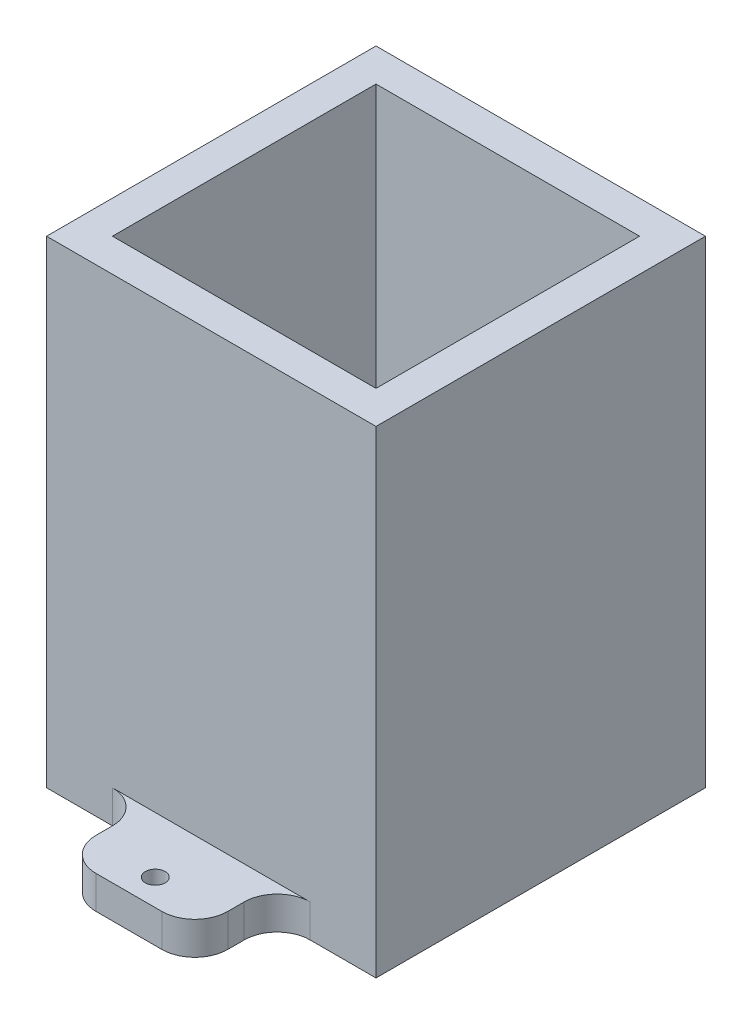
ISO-10303-21;
HEADER;
FILE_DESCRIPTION(('STEP AP214'),'2;1');
FILE_NAME('part.step','',(''),(''),'','','');
FILE_SCHEMA(('AUTOMOTIVE_DESIGN { 1 0 10303 214 1 1 1 1 }'));
ENDSEC;
DATA;
#1=APPLICATION_CONTEXT('core data for automotive mechanical design processes');
#2=APPLICATION_PROTOCOL_DEFINITION('international standard','automotive_design',2000,#1);
#3=PRODUCT_CONTEXT('',#1,'mechanical');
#4=PRODUCT('Part','Part','',(#3));
#5=PRODUCT_RELATED_PRODUCT_CATEGORY('part','',(#4));
#6=PRODUCT_DEFINITION_FORMATION('','',#4);
#7=PRODUCT_DEFINITION_CONTEXT('part definition',#1,'design');
#8=PRODUCT_DEFINITION('design','',#6,#7);
#9=PRODUCT_DEFINITION_SHAPE('','',#8);
#10=(LENGTH_UNIT() NAMED_UNIT(*) SI_UNIT(.MILLI.,.METRE.));
#11=(NAMED_UNIT(*) PLANE_ANGLE_UNIT() SI_UNIT($,.RADIAN.));
#12=(NAMED_UNIT(*) SI_UNIT($,.STERADIAN.) SOLID_ANGLE_UNIT());
#13=UNCERTAINTY_MEASURE_WITH_UNIT(LENGTH_MEASURE(1.E-05),#10,'distance_accuracy_value','');
#14=(GEOMETRIC_REPRESENTATION_CONTEXT(3) GLOBAL_UNCERTAINTY_ASSIGNED_CONTEXT((#13)) GLOBAL_UNIT_ASSIGNED_CONTEXT((#10,
#11,#12)) REPRESENTATION_CONTEXT('',''));
#15=CARTESIAN_POINT('',(0.,0.,0.));
#16=DIRECTION('',(0.,0.,1.));
#17=DIRECTION('',(1.,0.,0.));
#18=AXIS2_PLACEMENT_3D('',#15,#16,#17);
#19=CARTESIAN_POINT('',(-50.,140.,-50.));
#20=DIRECTION('',(0.,0.,1.));
#21=DIRECTION('',(1.,0.,0.));
#22=AXIS2_PLACEMENT_3D('',#19,#20,#21);
#23=PLANE('',#22);
#24=DIRECTION('',(-1.,0.,0.));
#25=VECTOR('',#24,1.);
#26=CARTESIAN_POINT('',(-20.,5.,-50.));
#27=LINE('',#26,#25);
#28=CARTESIAN_POINT('',(30.,5.,-50.));
#29=VERTEX_POINT('',#28);
#30=CARTESIAN_POINT('',(-30.,5.,-50.));
#31=VERTEX_POINT('',#30);
#32=EDGE_CURVE('E636',#29,#31,#27,.T.);
#33=ORIENTED_EDGE('',*,*,#32,.T.);
#34=DIRECTION('',(0.,-1.,0.));
#35=VECTOR('',#34,1.);
#36=CARTESIAN_POINT('',(-30.,140.,-50.));
#37=LINE('',#36,#35);
#38=CARTESIAN_POINT('',(-30.,-5.,-50.));
#39=VERTEX_POINT('',#38);
#40=EDGE_CURVE('E220',#31,#39,#37,.T.);
#41=ORIENTED_EDGE('',*,*,#40,.T.);
#42=DIRECTION('',(1.,0.,0.));
#43=VECTOR('',#42,1.);
#44=CARTESIAN_POINT('',(-50.,-5.,-50.));
#45=LINE('',#44,#43);
#46=CARTESIAN_POINT('',(-50.,-5.,-50.));
#47=VERTEX_POINT('',#46);
#48=EDGE_CURVE('E214',#47,#39,#45,.T.);
#49=ORIENTED_EDGE('',*,*,#48,.F.);
#50=DIRECTION('',(0.,-1.,0.));
#51=VECTOR('',#50,1.);
#52=CARTESIAN_POINT('',(-50.,140.,-50.));
#53=LINE('',#52,#51);
#54=CARTESIAN_POINT('',(-50.,140.,-50.));
#55=VERTEX_POINT('',#54);
#56=EDGE_CURVE('E205',#55,#47,#53,.T.);
#57=ORIENTED_EDGE('',*,*,#56,.F.);
#58=DIRECTION('',(-1.,0.,0.));
#59=VECTOR('',#58,1.);
#60=CARTESIAN_POINT('',(-50.,140.,-50.));
#61=LINE('',#60,#59);
#62=CARTESIAN_POINT('',(50.,140.,-50.));
#63=VERTEX_POINT('',#62);
#64=EDGE_CURVE('E274',#63,#55,#61,.T.);
#65=ORIENTED_EDGE('',*,*,#64,.F.);
#66=DIRECTION('',(0.,-1.,0.));
#67=VECTOR('',#66,1.);
#68=CARTESIAN_POINT('',(50.,140.,-50.));
#69=LINE('',#68,#67);
#70=CARTESIAN_POINT('',(50.,-5.,-50.));
#71=VERTEX_POINT('',#70);
#72=EDGE_CURVE('E209',#63,#71,#69,.T.);
#73=ORIENTED_EDGE('',*,*,#72,.T.);
#74=CARTESIAN_POINT('',(30.,-5.,-50.));
#75=VERTEX_POINT('',#74);
#76=EDGE_CURVE('E219',#75,#71,#45,.T.);
#77=ORIENTED_EDGE('',*,*,#76,.F.);
#78=DIRECTION('',(0.,-1.,0.));
#79=VECTOR('',#78,1.);
#80=CARTESIAN_POINT('',(30.,140.,-50.));
#81=LINE('',#80,#79);
#82=EDGE_CURVE('E281',#75,#29,#81,.F.);
#83=ORIENTED_EDGE('',*,*,#82,.T.);
#84=EDGE_LOOP('',(#33,#41,#49,#57,#65,#73,#77,#83));
#85=FACE_BOUND('',#84,.T.);
#86=ADVANCED_FACE('F39',(#85),#23,.F.);
#87=CARTESIAN_POINT('',(-50.,140.,50.));
#88=DIRECTION('',(0.,0.,-1.));
#89=DIRECTION('',(-1.,0.,0.));
#90=AXIS2_PLACEMENT_3D('',#87,#88,#89);
#91=PLANE('',#90);
#92=DIRECTION('',(1.,0.,0.));
#93=VECTOR('',#92,1.);
#94=CARTESIAN_POINT('',(-20.,5.,50.));
#95=LINE('',#94,#93);
#96=CARTESIAN_POINT('',(-30.,5.,50.));
#97=VERTEX_POINT('',#96);
#98=CARTESIAN_POINT('',(30.,5.,50.));
#99=VERTEX_POINT('',#98);
#100=EDGE_CURVE('E368',#97,#99,#95,.T.);
#101=ORIENTED_EDGE('',*,*,#100,.T.);
#102=DIRECTION('',(0.,-1.,0.));
#103=VECTOR('',#102,1.);
#104=CARTESIAN_POINT('',(30.,140.,50.));
#105=LINE('',#104,#103);
#106=CARTESIAN_POINT('',(30.,-5.,50.));
#107=VERTEX_POINT('',#106);
#108=EDGE_CURVE('E317',#99,#107,#105,.T.);
#109=ORIENTED_EDGE('',*,*,#108,.T.);
#110=DIRECTION('',(-1.,0.,0.));
#111=VECTOR('',#110,1.);
#112=CARTESIAN_POINT('',(-50.,-5.,50.));
#113=LINE('',#112,#111);
#114=CARTESIAN_POINT('',(50.,-5.,50.));
#115=VERTEX_POINT('',#114);
#116=EDGE_CURVE('E240',#115,#107,#113,.T.);
#117=ORIENTED_EDGE('',*,*,#116,.F.);
#118=DIRECTION('',(0.,-1.,0.));
#119=VECTOR('',#118,1.);
#120=CARTESIAN_POINT('',(50.,140.,50.));
#121=LINE('',#120,#119);
#122=CARTESIAN_POINT('',(50.,140.,50.));
#123=VERTEX_POINT('',#122);
#124=EDGE_CURVE('E278',#123,#115,#121,.T.);
#125=ORIENTED_EDGE('',*,*,#124,.F.);
#126=DIRECTION('',(1.,0.,0.));
#127=VECTOR('',#126,1.);
#128=CARTESIAN_POINT('',(-50.,140.,50.));
#129=LINE('',#128,#127);
#130=CARTESIAN_POINT('',(-50.,140.,50.));
#131=VERTEX_POINT('',#130);
#132=EDGE_CURVE('E279',#131,#123,#129,.T.);
#133=ORIENTED_EDGE('',*,*,#132,.F.);
#134=DIRECTION('',(0.,-1.,0.));
#135=VECTOR('',#134,1.);
#136=CARTESIAN_POINT('',(-50.,140.,50.));
#137=LINE('',#136,#135);
#138=CARTESIAN_POINT('',(-50.,-5.,50.));
#139=VERTEX_POINT('',#138);
#140=EDGE_CURVE('E211',#131,#139,#137,.T.);
#141=ORIENTED_EDGE('',*,*,#140,.T.);
#142=CARTESIAN_POINT('',(-30.,-5.,50.));
#143=VERTEX_POINT('',#142);
#144=EDGE_CURVE('E228',#143,#139,#113,.T.);
#145=ORIENTED_EDGE('',*,*,#144,.F.);
#146=DIRECTION('',(0.,-1.,0.));
#147=VECTOR('',#146,1.);
#148=CARTESIAN_POINT('',(-30.,140.,50.));
#149=LINE('',#148,#147);
#150=EDGE_CURVE('E316',#143,#97,#149,.F.);
#151=ORIENTED_EDGE('',*,*,#150,.T.);
#152=EDGE_LOOP('',(#101,#109,#117,#125,#133,#141,#145,#151));
#153=FACE_BOUND('',#152,.T.);
#154=ADVANCED_FACE('F357',(#153),#91,.F.);
#155=CARTESIAN_POINT('',(0.,140.,0.));
#156=DIRECTION('',(0.,-1.,0.));
#157=DIRECTION('',(0.,0.,-1.));
#158=AXIS2_PLACEMENT_3D('',#155,#156,#157);
#159=PLANE('',#158);
#160=DIRECTION('',(0.,0.,-1.));
#161=VECTOR('',#160,1.);
#162=CARTESIAN_POINT('',(50.,140.,50.));
#163=LINE('',#162,#161);
#164=EDGE_CURVE('E275',#123,#63,#163,.T.);
#165=ORIENTED_EDGE('',*,*,#164,.T.);
#166=ORIENTED_EDGE('',*,*,#64,.T.);
#167=DIRECTION('',(0.,0.,1.));
#168=VECTOR('',#167,1.);
#169=CARTESIAN_POINT('',(-50.,140.,50.));
#170=LINE('',#169,#168);
#171=EDGE_CURVE('E208',#55,#131,#170,.T.);
#172=ORIENTED_EDGE('',*,*,#171,.T.);
#173=ORIENTED_EDGE('',*,*,#132,.T.);
#174=EDGE_LOOP('',(#165,#166,#172,#173));
#175=FACE_BOUND('',#174,.T.);
#176=DIRECTION('',(0.,0.,1.));
#177=VECTOR('',#176,1.);
#178=CARTESIAN_POINT('',(-40.,140.,40.));
#179=LINE('',#178,#177);
#180=CARTESIAN_POINT('',(-40.,140.,-40.));
#181=VERTEX_POINT('',#180);
#182=CARTESIAN_POINT('',(-40.,140.,40.));
#183=VERTEX_POINT('',#182);
#184=EDGE_CURVE('E243',#181,#183,#179,.T.);
#185=ORIENTED_EDGE('',*,*,#184,.F.);
#186=DIRECTION('',(-1.,0.,0.));
#187=VECTOR('',#186,1.);
#188=CARTESIAN_POINT('',(-40.,140.,-40.));
#189=LINE('',#188,#187);
#190=CARTESIAN_POINT('',(40.,140.,-40.));
#191=VERTEX_POINT('',#190);
#192=EDGE_CURVE('E247',#191,#181,#189,.T.);
#193=ORIENTED_EDGE('',*,*,#192,.F.);
#194=DIRECTION('',(0.,0.,-1.));
#195=VECTOR('',#194,1.);
#196=CARTESIAN_POINT('',(40.,140.,40.));
#197=LINE('',#196,#195);
#198=CARTESIAN_POINT('',(40.,140.,40.));
#199=VERTEX_POINT('',#198);
#200=EDGE_CURVE('E248',#199,#191,#197,.T.);
#201=ORIENTED_EDGE('',*,*,#200,.F.);
#202=DIRECTION('',(1.,0.,0.));
#203=VECTOR('',#202,1.);
#204=CARTESIAN_POINT('',(-40.,140.,40.));
#205=LINE('',#204,#203);
#206=EDGE_CURVE('E242',#183,#199,#205,.T.);
#207=ORIENTED_EDGE('',*,*,#206,.F.);
#208=EDGE_LOOP('',(#185,#193,#201,#207));
#209=FACE_BOUND('',#208,.T.);
#210=ADVANCED_FACE('F412',(#175,#209),#159,.F.);
#211=CARTESIAN_POINT('',(50.,140.,50.));
#212=DIRECTION('',(-1.,0.,0.));
#213=DIRECTION('',(0.,0.,1.));
#214=AXIS2_PLACEMENT_3D('',#211,#212,#213);
#215=PLANE('',#214);
#216=ORIENTED_EDGE('',*,*,#124,.T.);
#217=DIRECTION('',(0.,0.,1.));
#218=VECTOR('',#217,1.);
#219=CARTESIAN_POINT('',(50.,-5.,-50.));
#220=LINE('',#219,#218);
#221=EDGE_CURVE('E218',#71,#115,#220,.T.);
#222=ORIENTED_EDGE('',*,*,#221,.F.);
#223=ORIENTED_EDGE('',*,*,#72,.F.);
#224=ORIENTED_EDGE('',*,*,#164,.F.);
#225=EDGE_LOOP('',(#216,#222,#223,#224));
#226=FACE_BOUND('',#225,.T.);
#227=ADVANCED_FACE('F416',(#226),#215,.F.);
#228=CARTESIAN_POINT('',(-50.,140.,50.));
#229=DIRECTION('',(1.,0.,0.));
#230=DIRECTION('',(0.,0.,-1.));
#231=AXIS2_PLACEMENT_3D('',#228,#229,#230);
#232=PLANE('',#231);
#233=ORIENTED_EDGE('',*,*,#56,.T.);
#234=DIRECTION('',(0.,0.,-1.));
#235=VECTOR('',#234,1.);
#236=CARTESIAN_POINT('',(-50.,-5.,-50.));
#237=LINE('',#236,#235);
#238=EDGE_CURVE('E210',#139,#47,#237,.T.);
#239=ORIENTED_EDGE('',*,*,#238,.F.);
#240=ORIENTED_EDGE('',*,*,#140,.F.);
#241=ORIENTED_EDGE('',*,*,#171,.F.);
#242=EDGE_LOOP('',(#233,#239,#240,#241));
#243=FACE_BOUND('',#242,.T.);
#244=ADVANCED_FACE('F204',(#243),#232,.F.);
#245=CARTESIAN_POINT('',(-40.,140.,40.));
#246=DIRECTION('',(1.,0.,0.));
#247=DIRECTION('',(0.,0.,-1.));
#248=AXIS2_PLACEMENT_3D('',#245,#246,#247);
#249=PLANE('',#248);
#250=DIRECTION('',(0.,0.,1.));
#251=VECTOR('',#250,1.);
#252=CARTESIAN_POINT('',(-40.,0.,40.));
#253=LINE('',#252,#251);
#254=CARTESIAN_POINT('',(-40.,0.,-40.));
#255=VERTEX_POINT('',#254);
#256=CARTESIAN_POINT('',(-40.,0.,40.));
#257=VERTEX_POINT('',#256);
#258=EDGE_CURVE('E238',#255,#257,#253,.T.);
#259=ORIENTED_EDGE('',*,*,#258,.F.);
#260=DIRECTION('',(0.,-1.,0.));
#261=VECTOR('',#260,1.);
#262=CARTESIAN_POINT('',(-40.,140.,-40.));
#263=LINE('',#262,#261);
#264=EDGE_CURVE('E253',#181,#255,#263,.T.);
#265=ORIENTED_EDGE('',*,*,#264,.F.);
#266=ORIENTED_EDGE('',*,*,#184,.T.);
#267=DIRECTION('',(0.,-1.,0.));
#268=VECTOR('',#267,1.);
#269=CARTESIAN_POINT('',(-40.,140.,40.));
#270=LINE('',#269,#268);
#271=EDGE_CURVE('E267',#183,#257,#270,.T.);
#272=ORIENTED_EDGE('',*,*,#271,.T.);
#273=EDGE_LOOP('',(#259,#265,#266,#272));
#274=FACE_BOUND('',#273,.T.);
#275=ADVANCED_FACE('F602',(#274),#249,.T.);
#276=CARTESIAN_POINT('',(-40.,140.,40.));
#277=DIRECTION('',(0.,0.,-1.));
#278=DIRECTION('',(-1.,0.,0.));
#279=AXIS2_PLACEMENT_3D('',#276,#277,#278);
#280=PLANE('',#279);
#281=DIRECTION('',(1.,0.,0.));
#282=VECTOR('',#281,1.);
#283=CARTESIAN_POINT('',(-40.,0.,40.));
#284=LINE('',#283,#282);
#285=CARTESIAN_POINT('',(40.,0.,40.));
#286=VERTEX_POINT('',#285);
#287=EDGE_CURVE('E255',#257,#286,#284,.T.);
#288=ORIENTED_EDGE('',*,*,#287,.F.);
#289=ORIENTED_EDGE('',*,*,#271,.F.);
#290=ORIENTED_EDGE('',*,*,#206,.T.);
#291=DIRECTION('',(0.,-1.,0.));
#292=VECTOR('',#291,1.);
#293=CARTESIAN_POINT('',(40.,140.,40.));
#294=LINE('',#293,#292);
#295=EDGE_CURVE('E270',#199,#286,#294,.T.);
#296=ORIENTED_EDGE('',*,*,#295,.T.);
#297=EDGE_LOOP('',(#288,#289,#290,#296));
#298=FACE_BOUND('',#297,.T.);
#299=ADVANCED_FACE('F597',(#298),#280,.T.);
#300=CARTESIAN_POINT('',(40.,140.,40.));
#301=DIRECTION('',(-1.,0.,0.));
#302=DIRECTION('',(0.,0.,1.));
#303=AXIS2_PLACEMENT_3D('',#300,#301,#302);
#304=PLANE('',#303);
#305=DIRECTION('',(0.,0.,-1.));
#306=VECTOR('',#305,1.);
#307=CARTESIAN_POINT('',(40.,0.,40.));
#308=LINE('',#307,#306);
#309=CARTESIAN_POINT('',(40.,0.,-40.));
#310=VERTEX_POINT('',#309);
#311=EDGE_CURVE('E260',#286,#310,#308,.T.);
#312=ORIENTED_EDGE('',*,*,#311,.F.);
#313=ORIENTED_EDGE('',*,*,#295,.F.);
#314=ORIENTED_EDGE('',*,*,#200,.T.);
#315=DIRECTION('',(0.,-1.,0.));
#316=VECTOR('',#315,1.);
#317=CARTESIAN_POINT('',(40.,140.,-40.));
#318=LINE('',#317,#316);
#319=EDGE_CURVE('E262',#191,#310,#318,.T.);
#320=ORIENTED_EDGE('',*,*,#319,.T.);
#321=EDGE_LOOP('',(#312,#313,#314,#320));
#322=FACE_BOUND('',#321,.T.);
#323=ADVANCED_FACE('F594',(#322),#304,.T.);
#324=CARTESIAN_POINT('',(-40.,140.,-40.));
#325=DIRECTION('',(0.,0.,1.));
#326=DIRECTION('',(1.,0.,0.));
#327=AXIS2_PLACEMENT_3D('',#324,#325,#326);
#328=PLANE('',#327);
#329=DIRECTION('',(-1.,0.,0.));
#330=VECTOR('',#329,1.);
#331=CARTESIAN_POINT('',(-40.,0.,-40.));
#332=LINE('',#331,#330);
#333=EDGE_CURVE('E245',#310,#255,#332,.T.);
#334=ORIENTED_EDGE('',*,*,#333,.F.);
#335=ORIENTED_EDGE('',*,*,#319,.F.);
#336=ORIENTED_EDGE('',*,*,#192,.T.);
#337=ORIENTED_EDGE('',*,*,#264,.T.);
#338=EDGE_LOOP('',(#334,#335,#336,#337));
#339=FACE_BOUND('',#338,.T.);
#340=ADVANCED_FACE('F536',(#339),#328,.T.);
#341=CARTESIAN_POINT('',(0.,-5.,0.));
#342=DIRECTION('',(0.,1.,0.));
#343=DIRECTION('',(0.,0.,1.));
#344=AXIS2_PLACEMENT_3D('',#341,#342,#343);
#345=PLANE('',#344);
#346=CARTESIAN_POINT('',(0.,-5.,-67.));
#347=DIRECTION('',(0.,1.,0.));
#348=DIRECTION('',(0.,0.,1.));
#349=AXIS2_PLACEMENT_3D('',#346,#347,#348);
#350=CIRCLE('',#349,3.);
#351=CARTESIAN_POINT('',(0.,-5.,-64.));
#352=VERTEX_POINT('',#351);
#353=EDGE_CURVE('E651',#352,#352,#350,.T.);
#354=ORIENTED_EDGE('',*,*,#353,.T.);
#355=EDGE_LOOP('',(#354));
#356=FACE_BOUND('',#355,.T.);
#357=CARTESIAN_POINT('',(0.,-5.,67.));
#358=DIRECTION('',(0.,1.,0.));
#359=DIRECTION('',(0.,0.,-1.));
#360=AXIS2_PLACEMENT_3D('',#357,#358,#359);
#361=CIRCLE('',#360,3.);
#362=CARTESIAN_POINT('',(0.,-5.,64.));
#363=VERTEX_POINT('',#362);
#364=EDGE_CURVE('E659',#363,#363,#361,.T.);
#365=ORIENTED_EDGE('',*,*,#364,.T.);
#366=EDGE_LOOP('',(#365));
#367=FACE_BOUND('',#366,.T.);
#368=DIRECTION('',(0.,0.,-1.));
#369=VECTOR('',#368,1.);
#370=CARTESIAN_POINT('',(-20.,-5.,-50.));
#371=LINE('',#370,#369);
#372=CARTESIAN_POINT('',(-20.,-5.,-60.));
#373=VERTEX_POINT('',#372);
#374=CARTESIAN_POINT('',(-20.,-5.,-65.));
#375=VERTEX_POINT('',#374);
#376=EDGE_CURVE('E647',#373,#375,#371,.T.);
#377=ORIENTED_EDGE('',*,*,#376,.T.);
#378=CARTESIAN_POINT('',(-10.,-5.,-65.));
#379=DIRECTION('',(0.,1.,0.));
#380=DIRECTION('',(0.,0.,1.));
#381=AXIS2_PLACEMENT_3D('',#378,#379,#380);
#382=CIRCLE('',#381,10.);
#383=CARTESIAN_POINT('',(-10.,-5.,-75.));
#384=VERTEX_POINT('',#383);
#385=EDGE_CURVE('E304',#375,#384,#382,.F.);
#386=ORIENTED_EDGE('',*,*,#385,.T.);
#387=DIRECTION('',(1.,0.,0.));
#388=VECTOR('',#387,1.);
#389=CARTESIAN_POINT('',(-20.,-5.,-75.));
#390=LINE('',#389,#388);
#391=CARTESIAN_POINT('',(10.,-5.,-75.));
#392=VERTEX_POINT('',#391);
#393=EDGE_CURVE('E649',#384,#392,#390,.T.);
#394=ORIENTED_EDGE('',*,*,#393,.T.);
#395=CARTESIAN_POINT('',(10.,-5.,-65.));
#396=DIRECTION('',(0.,1.,0.));
#397=DIRECTION('',(0.,0.,1.));
#398=AXIS2_PLACEMENT_3D('',#395,#396,#397);
#399=CIRCLE('',#398,10.);
#400=CARTESIAN_POINT('',(20.,-5.,-65.));
#401=VERTEX_POINT('',#400);
#402=EDGE_CURVE('E301',#392,#401,#399,.F.);
#403=ORIENTED_EDGE('',*,*,#402,.T.);
#404=DIRECTION('',(0.,0.,1.));
#405=VECTOR('',#404,1.);
#406=CARTESIAN_POINT('',(20.,-5.,-50.));
#407=LINE('',#406,#405);
#408=CARTESIAN_POINT('',(20.,-5.,-60.));
#409=VERTEX_POINT('',#408);
#410=EDGE_CURVE('E378',#401,#409,#407,.T.);
#411=ORIENTED_EDGE('',*,*,#410,.T.);
#412=CARTESIAN_POINT('',(30.,-5.,-60.));
#413=DIRECTION('',(0.,1.,0.));
#414=DIRECTION('',(0.,0.,1.));
#415=AXIS2_PLACEMENT_3D('',#412,#413,#414);
#416=CIRCLE('',#415,10.);
#417=EDGE_CURVE('E342',#409,#75,#416,.T.);
#418=ORIENTED_EDGE('',*,*,#417,.T.);
#419=ORIENTED_EDGE('',*,*,#76,.T.);
#420=ORIENTED_EDGE('',*,*,#221,.T.);
#421=ORIENTED_EDGE('',*,*,#116,.T.);
#422=CARTESIAN_POINT('',(30.,-5.,60.));
#423=DIRECTION('',(0.,1.,0.));
#424=DIRECTION('',(0.,0.,1.));
#425=AXIS2_PLACEMENT_3D('',#422,#423,#424);
#426=CIRCLE('',#425,10.);
#427=CARTESIAN_POINT('',(20.,-5.,60.));
#428=VERTEX_POINT('',#427);
#429=EDGE_CURVE('E346',#107,#428,#426,.T.);
#430=ORIENTED_EDGE('',*,*,#429,.T.);
#431=DIRECTION('',(0.,0.,1.));
#432=VECTOR('',#431,1.);
#433=CARTESIAN_POINT('',(20.,-5.,50.));
#434=LINE('',#433,#432);
#435=CARTESIAN_POINT('',(20.,-5.,65.));
#436=VERTEX_POINT('',#435);
#437=EDGE_CURVE('E374',#428,#436,#434,.T.);
#438=ORIENTED_EDGE('',*,*,#437,.T.);
#439=CARTESIAN_POINT('',(10.,-5.,65.));
#440=DIRECTION('',(0.,1.,0.));
#441=DIRECTION('',(0.,0.,1.));
#442=AXIS2_PLACEMENT_3D('',#439,#440,#441);
#443=CIRCLE('',#442,10.);
#444=CARTESIAN_POINT('',(10.,-5.,75.));
#445=VERTEX_POINT('',#444);
#446=EDGE_CURVE('E303',#436,#445,#443,.F.);
#447=ORIENTED_EDGE('',*,*,#446,.T.);
#448=DIRECTION('',(-1.,0.,0.));
#449=VECTOR('',#448,1.);
#450=CARTESIAN_POINT('',(-20.,-5.,75.));
#451=LINE('',#450,#449);
#452=CARTESIAN_POINT('',(-10.,-5.,75.));
#453=VERTEX_POINT('',#452);
#454=EDGE_CURVE('E367',#445,#453,#451,.T.);
#455=ORIENTED_EDGE('',*,*,#454,.T.);
#456=CARTESIAN_POINT('',(-10.,-5.,65.));
#457=DIRECTION('',(0.,1.,0.));
#458=DIRECTION('',(0.,0.,1.));
#459=AXIS2_PLACEMENT_3D('',#456,#457,#458);
#460=CIRCLE('',#459,10.);
#461=CARTESIAN_POINT('',(-20.,-5.,65.));
#462=VERTEX_POINT('',#461);
#463=EDGE_CURVE('E300',#453,#462,#460,.F.);
#464=ORIENTED_EDGE('',*,*,#463,.T.);
#465=DIRECTION('',(0.,0.,-1.));
#466=VECTOR('',#465,1.);
#467=CARTESIAN_POINT('',(-20.,-5.,50.));
#468=LINE('',#467,#466);
#469=CARTESIAN_POINT('',(-20.,-5.,60.));
#470=VERTEX_POINT('',#469);
#471=EDGE_CURVE('E355',#462,#470,#468,.T.);
#472=ORIENTED_EDGE('',*,*,#471,.T.);
#473=CARTESIAN_POINT('',(-30.,-5.,60.));
#474=DIRECTION('',(0.,1.,0.));
#475=DIRECTION('',(0.,0.,1.));
#476=AXIS2_PLACEMENT_3D('',#473,#474,#475);
#477=CIRCLE('',#476,10.);
#478=EDGE_CURVE('E50',#470,#143,#477,.T.);
#479=ORIENTED_EDGE('',*,*,#478,.T.);
#480=ORIENTED_EDGE('',*,*,#144,.T.);
#481=ORIENTED_EDGE('',*,*,#238,.T.);
#482=ORIENTED_EDGE('',*,*,#48,.T.);
#483=CARTESIAN_POINT('',(-30.,-5.,-60.));
#484=DIRECTION('',(0.,1.,0.));
#485=DIRECTION('',(0.,0.,1.));
#486=AXIS2_PLACEMENT_3D('',#483,#484,#485);
#487=CIRCLE('',#486,10.);
#488=EDGE_CURVE('E340',#39,#373,#487,.T.);
#489=ORIENTED_EDGE('',*,*,#488,.T.);
#490=EDGE_LOOP('',(#377,#386,#394,#403,#411,#418,#419,#420,#421,#430,#438,#447,#455,#464,#472,
#479,#480,#481,#482,#489));
#491=FACE_BOUND('',#490,.T.);
#492=CARTESIAN_POINT('',(0.,-5.,0.));
#493=DIRECTION('',(0.,-1.,0.));
#494=DIRECTION('',(0.,0.,-1.));
#495=AXIS2_PLACEMENT_3D('',#492,#493,#494);
#496=CIRCLE('',#495,25.);
#497=CARTESIAN_POINT('',(0.,-5.,-25.));
#498=VERTEX_POINT('',#497);
#499=EDGE_CURVE('E227',#498,#498,#496,.T.);
#500=ORIENTED_EDGE('',*,*,#499,.F.);
#501=EDGE_LOOP('',(#500));
#502=FACE_BOUND('',#501,.T.);
#503=ADVANCED_FACE('F224',(#356,#367,#491,#502),#345,.F.);
#504=CARTESIAN_POINT('',(0.,0.,0.));
#505=DIRECTION('',(0.,1.,0.));
#506=DIRECTION('',(0.,0.,1.));
#507=AXIS2_PLACEMENT_3D('',#504,#505,#506);
#508=PLANE('',#507);
#509=ORIENTED_EDGE('',*,*,#311,.T.);
#510=ORIENTED_EDGE('',*,*,#333,.T.);
#511=ORIENTED_EDGE('',*,*,#258,.T.);
#512=ORIENTED_EDGE('',*,*,#287,.T.);
#513=EDGE_LOOP('',(#509,#510,#511,#512));
#514=FACE_BOUND('',#513,.T.);
#515=CARTESIAN_POINT('',(0.,0.,0.));
#516=DIRECTION('',(0.,-1.,0.));
#517=DIRECTION('',(0.,0.,-1.));
#518=AXIS2_PLACEMENT_3D('',#515,#516,#517);
#519=CIRCLE('',#518,25.);
#520=CARTESIAN_POINT('',(0.,0.,-25.));
#521=VERTEX_POINT('',#520);
#522=EDGE_CURVE('E233',#521,#521,#519,.T.);
#523=ORIENTED_EDGE('',*,*,#522,.T.);
#524=EDGE_LOOP('',(#523));
#525=FACE_BOUND('',#524,.T.);
#526=ADVANCED_FACE('F532',(#514,#525),#508,.T.);
#527=CARTESIAN_POINT('',(0.,-5.,0.));
#528=DIRECTION('',(0.,1.,0.));
#529=DIRECTION('',(0.,0.,1.));
#530=AXIS2_PLACEMENT_3D('',#527,#528,#529);
#531=CYLINDRICAL_SURFACE('',#530,25.);
#532=ORIENTED_EDGE('',*,*,#499,.T.);
#533=EDGE_LOOP('',(#532));
#534=FACE_BOUND('',#533,.T.);
#535=ORIENTED_EDGE('',*,*,#522,.F.);
#536=EDGE_LOOP('',(#535));
#537=FACE_BOUND('',#536,.T.);
#538=ADVANCED_FACE('F530',(#534,#537),#531,.F.);
#539=CARTESIAN_POINT('',(-20.,5.,50.));
#540=DIRECTION('',(-1.,0.,0.));
#541=DIRECTION('',(0.,0.,1.));
#542=AXIS2_PLACEMENT_3D('',#539,#540,#541);
#543=PLANE('',#542);
#544=DIRECTION('',(0.,0.,-1.));
#545=VECTOR('',#544,1.);
#546=CARTESIAN_POINT('',(-20.,5.,50.));
#547=LINE('',#546,#545);
#548=CARTESIAN_POINT('',(-20.,5.,65.));
#549=VERTEX_POINT('',#548);
#550=CARTESIAN_POINT('',(-20.,5.,60.));
#551=VERTEX_POINT('',#550);
#552=EDGE_CURVE('E364',#549,#551,#547,.T.);
#553=ORIENTED_EDGE('',*,*,#552,.T.);
#554=DIRECTION('',(0.,-1.,0.));
#555=VECTOR('',#554,1.);
#556=CARTESIAN_POINT('',(-20.,5.,60.));
#557=LINE('',#556,#555);
#558=EDGE_CURVE('E328',#551,#470,#557,.T.);
#559=ORIENTED_EDGE('',*,*,#558,.T.);
#560=ORIENTED_EDGE('',*,*,#471,.F.);
#561=DIRECTION('',(0.,-1.,0.));
#562=VECTOR('',#561,1.);
#563=CARTESIAN_POINT('',(-20.,5.,65.));
#564=LINE('',#563,#562);
#565=EDGE_CURVE('E330',#462,#549,#564,.F.);
#566=ORIENTED_EDGE('',*,*,#565,.T.);
#567=EDGE_LOOP('',(#553,#559,#560,#566));
#568=FACE_BOUND('',#567,.T.);
#569=ADVANCED_FACE('F366',(#568),#543,.T.);
#570=CARTESIAN_POINT('',(-20.,5.,75.));
#571=DIRECTION('',(0.,0.,1.));
#572=DIRECTION('',(1.,0.,0.));
#573=AXIS2_PLACEMENT_3D('',#570,#571,#572);
#574=PLANE('',#573);
#575=ORIENTED_EDGE('',*,*,#454,.F.);
#576=DIRECTION('',(0.,-1.,0.));
#577=VECTOR('',#576,1.);
#578=CARTESIAN_POINT('',(10.,5.,75.));
#579=LINE('',#578,#577);
#580=CARTESIAN_POINT('',(10.,5.,75.));
#581=VERTEX_POINT('',#580);
#582=EDGE_CURVE('E63',#445,#581,#579,.F.);
#583=ORIENTED_EDGE('',*,*,#582,.T.);
#584=DIRECTION('',(-1.,0.,0.));
#585=VECTOR('',#584,1.);
#586=CARTESIAN_POINT('',(-20.,5.,75.));
#587=LINE('',#586,#585);
#588=CARTESIAN_POINT('',(-10.,5.,75.));
#589=VERTEX_POINT('',#588);
#590=EDGE_CURVE('E382',#581,#589,#587,.T.);
#591=ORIENTED_EDGE('',*,*,#590,.T.);
#592=DIRECTION('',(0.,-1.,0.));
#593=VECTOR('',#592,1.);
#594=CARTESIAN_POINT('',(-10.,5.,75.));
#595=LINE('',#594,#593);
#596=EDGE_CURVE('E335',#589,#453,#595,.T.);
#597=ORIENTED_EDGE('',*,*,#596,.T.);
#598=EDGE_LOOP('',(#575,#583,#591,#597));
#599=FACE_BOUND('',#598,.T.);
#600=ADVANCED_FACE('F518',(#599),#574,.T.);
#601=CARTESIAN_POINT('',(20.,5.,50.));
#602=DIRECTION('',(1.,0.,0.));
#603=DIRECTION('',(0.,0.,-1.));
#604=AXIS2_PLACEMENT_3D('',#601,#602,#603);
#605=PLANE('',#604);
#606=ORIENTED_EDGE('',*,*,#437,.F.);
#607=DIRECTION('',(0.,-1.,0.));
#608=VECTOR('',#607,1.);
#609=CARTESIAN_POINT('',(20.,5.,60.));
#610=LINE('',#609,#608);
#611=CARTESIAN_POINT('',(20.,5.,60.));
#612=VERTEX_POINT('',#611);
#613=EDGE_CURVE('E324',#428,#612,#610,.F.);
#614=ORIENTED_EDGE('',*,*,#613,.T.);
#615=DIRECTION('',(0.,0.,1.));
#616=VECTOR('',#615,1.);
#617=CARTESIAN_POINT('',(20.,5.,50.));
#618=LINE('',#617,#616);
#619=CARTESIAN_POINT('',(20.,5.,65.));
#620=VERTEX_POINT('',#619);
#621=EDGE_CURVE('E375',#612,#620,#618,.T.);
#622=ORIENTED_EDGE('',*,*,#621,.T.);
#623=DIRECTION('',(0.,-1.,0.));
#624=VECTOR('',#623,1.);
#625=CARTESIAN_POINT('',(20.,5.,65.));
#626=LINE('',#625,#624);
#627=EDGE_CURVE('E325',#620,#436,#626,.T.);
#628=ORIENTED_EDGE('',*,*,#627,.T.);
#629=EDGE_LOOP('',(#606,#614,#622,#628));
#630=FACE_BOUND('',#629,.T.);
#631=ADVANCED_FACE('F393',(#630),#605,.T.);
#632=CARTESIAN_POINT('',(0.,5.,0.));
#633=DIRECTION('',(0.,1.,0.));
#634=DIRECTION('',(0.,0.,1.));
#635=AXIS2_PLACEMENT_3D('',#632,#633,#634);
#636=PLANE('',#635);
#637=CARTESIAN_POINT('',(0.,5.,67.));
#638=DIRECTION('',(0.,1.,0.));
#639=DIRECTION('',(0.,0.,-1.));
#640=AXIS2_PLACEMENT_3D('',#637,#638,#639);
#641=CIRCLE('',#640,3.);
#642=CARTESIAN_POINT('',(0.,5.,64.));
#643=VERTEX_POINT('',#642);
#644=EDGE_CURVE('E660',#643,#643,#641,.T.);
#645=ORIENTED_EDGE('',*,*,#644,.F.);
#646=EDGE_LOOP('',(#645));
#647=FACE_BOUND('',#646,.T.);
#648=ORIENTED_EDGE('',*,*,#590,.F.);
#649=CARTESIAN_POINT('',(10.,5.,65.));
#650=DIRECTION('',(0.,1.,0.));
#651=DIRECTION('',(0.,0.,1.));
#652=AXIS2_PLACEMENT_3D('',#649,#650,#651);
#653=CIRCLE('',#652,10.);
#654=EDGE_CURVE('E339',#581,#620,#653,.T.);
#655=ORIENTED_EDGE('',*,*,#654,.T.);
#656=ORIENTED_EDGE('',*,*,#621,.F.);
#657=CARTESIAN_POINT('',(30.,5.,60.));
#658=DIRECTION('',(0.,1.,0.));
#659=DIRECTION('',(0.,0.,1.));
#660=AXIS2_PLACEMENT_3D('',#657,#658,#659);
#661=CIRCLE('',#660,10.);
#662=EDGE_CURVE('E348',#612,#99,#661,.F.);
#663=ORIENTED_EDGE('',*,*,#662,.T.);
#664=ORIENTED_EDGE('',*,*,#100,.F.);
#665=CARTESIAN_POINT('',(-30.,5.,60.));
#666=DIRECTION('',(0.,1.,0.));
#667=DIRECTION('',(0.,0.,1.));
#668=AXIS2_PLACEMENT_3D('',#665,#666,#667);
#669=CIRCLE('',#668,10.);
#670=EDGE_CURVE('E11',#97,#551,#669,.F.);
#671=ORIENTED_EDGE('',*,*,#670,.T.);
#672=ORIENTED_EDGE('',*,*,#552,.F.);
#673=CARTESIAN_POINT('',(-10.,5.,65.));
#674=DIRECTION('',(0.,1.,0.));
#675=DIRECTION('',(0.,0.,1.));
#676=AXIS2_PLACEMENT_3D('',#673,#674,#675);
#677=CIRCLE('',#676,10.);
#678=EDGE_CURVE('E53',#549,#589,#677,.T.);
#679=ORIENTED_EDGE('',*,*,#678,.T.);
#680=EDGE_LOOP('',(#648,#655,#656,#663,#664,#671,#672,#679));
#681=FACE_BOUND('',#680,.T.);
#682=ADVANCED_FACE('F365',(#647,#681),#636,.T.);
#683=CARTESIAN_POINT('',(20.,5.,-50.));
#684=DIRECTION('',(1.,0.,0.));
#685=DIRECTION('',(0.,0.,-1.));
#686=AXIS2_PLACEMENT_3D('',#683,#684,#685);
#687=PLANE('',#686);
#688=DIRECTION('',(0.,0.,1.));
#689=VECTOR('',#688,1.);
#690=CARTESIAN_POINT('',(20.,5.,-50.));
#691=LINE('',#690,#689);
#692=CARTESIAN_POINT('',(20.,5.,-65.));
#693=VERTEX_POINT('',#692);
#694=CARTESIAN_POINT('',(20.,5.,-60.));
#695=VERTEX_POINT('',#694);
#696=EDGE_CURVE('E387',#693,#695,#691,.T.);
#697=ORIENTED_EDGE('',*,*,#696,.T.);
#698=DIRECTION('',(0.,-1.,0.));
#699=VECTOR('',#698,1.);
#700=CARTESIAN_POINT('',(20.,5.,-60.));
#701=LINE('',#700,#699);
#702=EDGE_CURVE('E298',#695,#409,#701,.T.);
#703=ORIENTED_EDGE('',*,*,#702,.T.);
#704=ORIENTED_EDGE('',*,*,#410,.F.);
#705=DIRECTION('',(0.,-1.,0.));
#706=VECTOR('',#705,1.);
#707=CARTESIAN_POINT('',(20.,5.,-65.));
#708=LINE('',#707,#706);
#709=EDGE_CURVE('E294',#401,#693,#708,.F.);
#710=ORIENTED_EDGE('',*,*,#709,.T.);
#711=EDGE_LOOP('',(#697,#703,#704,#710));
#712=FACE_BOUND('',#711,.T.);
#713=ADVANCED_FACE('F493',(#712),#687,.T.);
#714=CARTESIAN_POINT('',(-20.,5.,-75.));
#715=DIRECTION('',(0.,0.,-1.));
#716=DIRECTION('',(-1.,0.,0.));
#717=AXIS2_PLACEMENT_3D('',#714,#715,#716);
#718=PLANE('',#717);
#719=ORIENTED_EDGE('',*,*,#393,.F.);
#720=DIRECTION('',(0.,-1.,0.));
#721=VECTOR('',#720,1.);
#722=CARTESIAN_POINT('',(-10.,5.,-75.));
#723=LINE('',#722,#721);
#724=CARTESIAN_POINT('',(-10.,5.,-75.));
#725=VERTEX_POINT('',#724);
#726=EDGE_CURVE('E309',#384,#725,#723,.F.);
#727=ORIENTED_EDGE('',*,*,#726,.T.);
#728=DIRECTION('',(1.,0.,0.));
#729=VECTOR('',#728,1.);
#730=CARTESIAN_POINT('',(-20.,5.,-75.));
#731=LINE('',#730,#729);
#732=CARTESIAN_POINT('',(10.,5.,-75.));
#733=VERTEX_POINT('',#732);
#734=EDGE_CURVE('E645',#725,#733,#731,.T.);
#735=ORIENTED_EDGE('',*,*,#734,.T.);
#736=DIRECTION('',(0.,-1.,0.));
#737=VECTOR('',#736,1.);
#738=CARTESIAN_POINT('',(10.,5.,-75.));
#739=LINE('',#738,#737);
#740=EDGE_CURVE('E307',#733,#392,#739,.T.);
#741=ORIENTED_EDGE('',*,*,#740,.T.);
#742=EDGE_LOOP('',(#719,#727,#735,#741));
#743=FACE_BOUND('',#742,.T.);
#744=ADVANCED_FACE('F486',(#743),#718,.T.);
#745=CARTESIAN_POINT('',(-20.,5.,-50.));
#746=DIRECTION('',(-1.,0.,0.));
#747=DIRECTION('',(0.,0.,1.));
#748=AXIS2_PLACEMENT_3D('',#745,#746,#747);
#749=PLANE('',#748);
#750=ORIENTED_EDGE('',*,*,#376,.F.);
#751=DIRECTION('',(0.,-1.,0.));
#752=VECTOR('',#751,1.);
#753=CARTESIAN_POINT('',(-20.,5.,-60.));
#754=LINE('',#753,#752);
#755=CARTESIAN_POINT('',(-20.,5.,-60.));
#756=VERTEX_POINT('',#755);
#757=EDGE_CURVE('E295',#373,#756,#754,.F.);
#758=ORIENTED_EDGE('',*,*,#757,.T.);
#759=DIRECTION('',(0.,0.,-1.));
#760=VECTOR('',#759,1.);
#761=CARTESIAN_POINT('',(-20.,5.,-50.));
#762=LINE('',#761,#760);
#763=CARTESIAN_POINT('',(-20.,5.,-65.));
#764=VERTEX_POINT('',#763);
#765=EDGE_CURVE('E642',#756,#764,#762,.T.);
#766=ORIENTED_EDGE('',*,*,#765,.T.);
#767=DIRECTION('',(0.,-1.,0.));
#768=VECTOR('',#767,1.);
#769=CARTESIAN_POINT('',(-20.,5.,-65.));
#770=LINE('',#769,#768);
#771=EDGE_CURVE('E287',#764,#375,#770,.T.);
#772=ORIENTED_EDGE('',*,*,#771,.T.);
#773=EDGE_LOOP('',(#750,#758,#766,#772));
#774=FACE_BOUND('',#773,.T.);
#775=ADVANCED_FACE('F480',(#774),#749,.T.);
#776=CARTESIAN_POINT('',(0.,5.,0.));
#777=DIRECTION('',(0.,1.,0.));
#778=DIRECTION('',(0.,0.,1.));
#779=AXIS2_PLACEMENT_3D('',#776,#777,#778);
#780=PLANE('',#779);
#781=CARTESIAN_POINT('',(0.,5.,-67.));
#782=DIRECTION('',(0.,1.,0.));
#783=DIRECTION('',(0.,0.,1.));
#784=AXIS2_PLACEMENT_3D('',#781,#782,#783);
#785=CIRCLE('',#784,3.);
#786=CARTESIAN_POINT('',(0.,5.,-64.));
#787=VERTEX_POINT('',#786);
#788=EDGE_CURVE('E664',#787,#787,#785,.T.);
#789=ORIENTED_EDGE('',*,*,#788,.F.);
#790=EDGE_LOOP('',(#789));
#791=FACE_BOUND('',#790,.T.);
#792=ORIENTED_EDGE('',*,*,#734,.F.);
#793=CARTESIAN_POINT('',(-10.,5.,-65.));
#794=DIRECTION('',(0.,1.,0.));
#795=DIRECTION('',(0.,0.,1.));
#796=AXIS2_PLACEMENT_3D('',#793,#794,#795);
#797=CIRCLE('',#796,10.);
#798=EDGE_CURVE('E314',#725,#764,#797,.T.);
#799=ORIENTED_EDGE('',*,*,#798,.T.);
#800=ORIENTED_EDGE('',*,*,#765,.F.);
#801=CARTESIAN_POINT('',(-30.,5.,-60.));
#802=DIRECTION('',(0.,1.,0.));
#803=DIRECTION('',(0.,0.,1.));
#804=AXIS2_PLACEMENT_3D('',#801,#802,#803);
#805=CIRCLE('',#804,10.);
#806=EDGE_CURVE('E343',#756,#31,#805,.F.);
#807=ORIENTED_EDGE('',*,*,#806,.T.);
#808=ORIENTED_EDGE('',*,*,#32,.F.);
#809=CARTESIAN_POINT('',(30.,5.,-60.));
#810=DIRECTION('',(0.,1.,0.));
#811=DIRECTION('',(0.,0.,1.));
#812=AXIS2_PLACEMENT_3D('',#809,#810,#811);
#813=CIRCLE('',#812,10.);
#814=EDGE_CURVE('E347',#29,#695,#813,.F.);
#815=ORIENTED_EDGE('',*,*,#814,.T.);
#816=ORIENTED_EDGE('',*,*,#696,.F.);
#817=CARTESIAN_POINT('',(10.,5.,-65.));
#818=DIRECTION('',(0.,1.,0.));
#819=DIRECTION('',(0.,0.,1.));
#820=AXIS2_PLACEMENT_3D('',#817,#818,#819);
#821=CIRCLE('',#820,10.);
#822=EDGE_CURVE('E315',#693,#733,#821,.T.);
#823=ORIENTED_EDGE('',*,*,#822,.T.);
#824=EDGE_LOOP('',(#792,#799,#800,#807,#808,#815,#816,#823));
#825=FACE_BOUND('',#824,.T.);
#826=ADVANCED_FACE('F472',(#791,#825),#780,.T.);
#827=CARTESIAN_POINT('',(0.,-5.,-67.));
#828=DIRECTION('',(0.,1.,0.));
#829=DIRECTION('',(0.,0.,1.));
#830=AXIS2_PLACEMENT_3D('',#827,#828,#829);
#831=CYLINDRICAL_SURFACE('',#830,3.);
#832=ORIENTED_EDGE('',*,*,#353,.F.);
#833=EDGE_LOOP('',(#832));
#834=FACE_BOUND('',#833,.T.);
#835=ORIENTED_EDGE('',*,*,#788,.T.);
#836=EDGE_LOOP('',(#835));
#837=FACE_BOUND('',#836,.T.);
#838=ADVANCED_FACE('F478',(#834,#837),#831,.F.);
#839=CARTESIAN_POINT('',(0.,-5.,67.));
#840=DIRECTION('',(0.,1.,0.));
#841=DIRECTION('',(0.,0.,1.));
#842=AXIS2_PLACEMENT_3D('',#839,#840,#841);
#843=CYLINDRICAL_SURFACE('',#842,3.);
#844=ORIENTED_EDGE('',*,*,#364,.F.);
#845=EDGE_LOOP('',(#844));
#846=FACE_BOUND('',#845,.T.);
#847=ORIENTED_EDGE('',*,*,#644,.T.);
#848=EDGE_LOOP('',(#847));
#849=FACE_BOUND('',#848,.T.);
#850=ADVANCED_FACE('F426',(#846,#849),#843,.F.);
#851=CARTESIAN_POINT('',(-30.,140.,-60.));
#852=DIRECTION('',(0.,-1.,0.));
#853=DIRECTION('',(0.,0.,-1.));
#854=AXIS2_PLACEMENT_3D('',#851,#852,#853);
#855=CYLINDRICAL_SURFACE('',#854,10.);
#856=ORIENTED_EDGE('',*,*,#806,.F.);
#857=ORIENTED_EDGE('',*,*,#757,.F.);
#858=ORIENTED_EDGE('',*,*,#488,.F.);
#859=ORIENTED_EDGE('',*,*,#40,.F.);
#860=EDGE_LOOP('',(#856,#857,#858,#859));
#861=FACE_BOUND('',#860,.T.);
#862=ADVANCED_FACE('F425',(#861),#855,.F.);
#863=CARTESIAN_POINT('',(30.,5.,-60.));
#864=DIRECTION('',(0.,-1.,0.));
#865=DIRECTION('',(0.,0.,-1.));
#866=AXIS2_PLACEMENT_3D('',#863,#864,#865);
#867=CYLINDRICAL_SURFACE('',#866,10.);
#868=ORIENTED_EDGE('',*,*,#814,.F.);
#869=ORIENTED_EDGE('',*,*,#82,.F.);
#870=ORIENTED_EDGE('',*,*,#417,.F.);
#871=ORIENTED_EDGE('',*,*,#702,.F.);
#872=EDGE_LOOP('',(#868,#869,#870,#871));
#873=FACE_BOUND('',#872,.T.);
#874=ADVANCED_FACE('F422',(#873),#867,.F.);
#875=CARTESIAN_POINT('',(-10.,5.,-65.));
#876=DIRECTION('',(0.,-1.,0.));
#877=DIRECTION('',(0.,0.,-1.));
#878=AXIS2_PLACEMENT_3D('',#875,#876,#877);
#879=CYLINDRICAL_SURFACE('',#878,10.);
#880=ORIENTED_EDGE('',*,*,#798,.F.);
#881=ORIENTED_EDGE('',*,*,#726,.F.);
#882=ORIENTED_EDGE('',*,*,#385,.F.);
#883=ORIENTED_EDGE('',*,*,#771,.F.);
#884=EDGE_LOOP('',(#880,#881,#882,#883));
#885=FACE_BOUND('',#884,.T.);
#886=ADVANCED_FACE('F429',(#885),#879,.T.);
#887=CARTESIAN_POINT('',(10.,5.,-65.));
#888=DIRECTION('',(0.,-1.,0.));
#889=DIRECTION('',(0.,0.,-1.));
#890=AXIS2_PLACEMENT_3D('',#887,#888,#889);
#891=CYLINDRICAL_SURFACE('',#890,10.);
#892=ORIENTED_EDGE('',*,*,#822,.F.);
#893=ORIENTED_EDGE('',*,*,#709,.F.);
#894=ORIENTED_EDGE('',*,*,#402,.F.);
#895=ORIENTED_EDGE('',*,*,#740,.F.);
#896=EDGE_LOOP('',(#892,#893,#894,#895));
#897=FACE_BOUND('',#896,.T.);
#898=ADVANCED_FACE('F432',(#897),#891,.T.);
#899=CARTESIAN_POINT('',(30.,140.,60.));
#900=DIRECTION('',(0.,-1.,0.));
#901=DIRECTION('',(0.,0.,-1.));
#902=AXIS2_PLACEMENT_3D('',#899,#900,#901);
#903=CYLINDRICAL_SURFACE('',#902,10.);
#904=ORIENTED_EDGE('',*,*,#662,.F.);
#905=ORIENTED_EDGE('',*,*,#613,.F.);
#906=ORIENTED_EDGE('',*,*,#429,.F.);
#907=ORIENTED_EDGE('',*,*,#108,.F.);
#908=EDGE_LOOP('',(#904,#905,#906,#907));
#909=FACE_BOUND('',#908,.T.);
#910=ADVANCED_FACE('F398',(#909),#903,.F.);
#911=CARTESIAN_POINT('',(-30.,5.,60.));
#912=DIRECTION('',(0.,-1.,0.));
#913=DIRECTION('',(0.,0.,-1.));
#914=AXIS2_PLACEMENT_3D('',#911,#912,#913);
#915=CYLINDRICAL_SURFACE('',#914,10.);
#916=ORIENTED_EDGE('',*,*,#670,.F.);
#917=ORIENTED_EDGE('',*,*,#150,.F.);
#918=ORIENTED_EDGE('',*,*,#478,.F.);
#919=ORIENTED_EDGE('',*,*,#558,.F.);
#920=EDGE_LOOP('',(#916,#917,#918,#919));
#921=FACE_BOUND('',#920,.T.);
#922=ADVANCED_FACE('F362',(#921),#915,.F.);
#923=CARTESIAN_POINT('',(10.,5.,65.));
#924=DIRECTION('',(0.,-1.,0.));
#925=DIRECTION('',(0.,0.,-1.));
#926=AXIS2_PLACEMENT_3D('',#923,#924,#925);
#927=CYLINDRICAL_SURFACE('',#926,10.);
#928=ORIENTED_EDGE('',*,*,#654,.F.);
#929=ORIENTED_EDGE('',*,*,#582,.F.);
#930=ORIENTED_EDGE('',*,*,#446,.F.);
#931=ORIENTED_EDGE('',*,*,#627,.F.);
#932=EDGE_LOOP('',(#928,#929,#930,#931));
#933=FACE_BOUND('',#932,.T.);
#934=ADVANCED_FACE('F399',(#933),#927,.T.);
#935=CARTESIAN_POINT('',(-10.,5.,65.));
#936=DIRECTION('',(0.,-1.,0.));
#937=DIRECTION('',(0.,0.,-1.));
#938=AXIS2_PLACEMENT_3D('',#935,#936,#937);
#939=CYLINDRICAL_SURFACE('',#938,10.);
#940=ORIENTED_EDGE('',*,*,#678,.F.);
#941=ORIENTED_EDGE('',*,*,#565,.F.);
#942=ORIENTED_EDGE('',*,*,#463,.F.);
#943=ORIENTED_EDGE('',*,*,#596,.F.);
#944=EDGE_LOOP('',(#940,#941,#942,#943));
#945=FACE_BOUND('',#944,.T.);
#946=ADVANCED_FACE('F41',(#945),#939,.T.);
#947=CLOSED_SHELL('',(#86,#154,#210,#227,#244,#275,#299,#323,#340,#503,#526,#538,#569,#600,#631,
#682,#713,#744,#775,#826,#838,#850,#862,#874,#886,#898,#910,#922,#934,#946));
#948=MANIFOLD_SOLID_BREP('B2',#947);
#949=ADVANCED_BREP_SHAPE_REPRESENTATION('',(#18,#948),#14);
#950=SHAPE_DEFINITION_REPRESENTATION(#9,#949);
ENDSEC;
END-ISO-10303-21;
